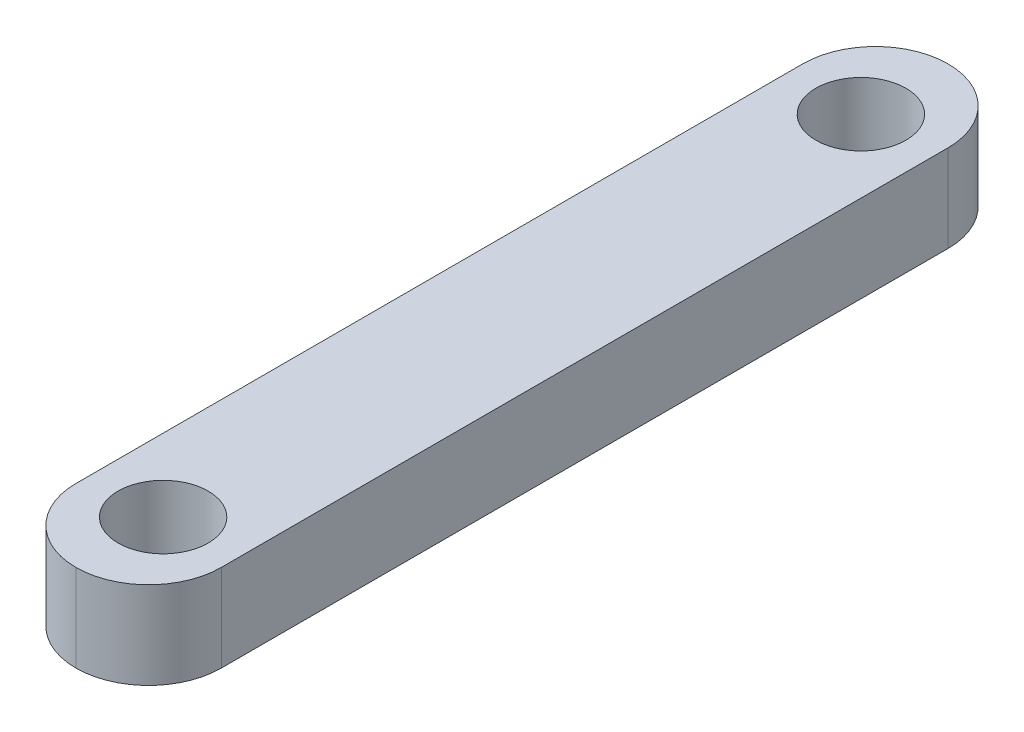
ISO-10303-21;
HEADER;
FILE_DESCRIPTION(('STEP AP214'),'2;1');
FILE_NAME('part.step','',(''),(''),'','','');
FILE_SCHEMA(('AUTOMOTIVE_DESIGN { 1 0 10303 214 1 1 1 1 }'));
ENDSEC;
DATA;
#1=APPLICATION_CONTEXT('core data for automotive mechanical design processes');
#2=APPLICATION_PROTOCOL_DEFINITION('international standard','automotive_design',2000,#1);
#3=PRODUCT_CONTEXT('',#1,'mechanical');
#4=PRODUCT('Part','Part','',(#3));
#5=PRODUCT_RELATED_PRODUCT_CATEGORY('part','',(#4));
#6=PRODUCT_DEFINITION_FORMATION('','',#4);
#7=PRODUCT_DEFINITION_CONTEXT('part definition',#1,'design');
#8=PRODUCT_DEFINITION('design','',#6,#7);
#9=PRODUCT_DEFINITION_SHAPE('','',#8);
#10=(LENGTH_UNIT() NAMED_UNIT(*) SI_UNIT(.MILLI.,.METRE.));
#11=(NAMED_UNIT(*) PLANE_ANGLE_UNIT() SI_UNIT($,.RADIAN.));
#12=(NAMED_UNIT(*) SI_UNIT($,.STERADIAN.) SOLID_ANGLE_UNIT());
#13=UNCERTAINTY_MEASURE_WITH_UNIT(LENGTH_MEASURE(1.E-05),#10,'distance_accuracy_value','');
#14=(GEOMETRIC_REPRESENTATION_CONTEXT(3) GLOBAL_UNCERTAINTY_ASSIGNED_CONTEXT((#13)) GLOBAL_UNIT_ASSIGNED_CONTEXT((#10,
#11,#12)) REPRESENTATION_CONTEXT('',''));
#15=CARTESIAN_POINT('',(0.,0.,0.));
#16=DIRECTION('',(0.,0.,1.));
#17=DIRECTION('',(1.,0.,0.));
#18=AXIS2_PLACEMENT_3D('',#15,#16,#17);
#19=CARTESIAN_POINT('',(0.,3.,0.));
#20=DIRECTION('',(0.,-1.,0.));
#21=DIRECTION('',(0.,0.,-1.));
#22=AXIS2_PLACEMENT_3D('',#19,#20,#21);
#23=PLANE('',#22);
#24=CARTESIAN_POINT('',(0.,3.,12.5));
#25=DIRECTION('',(0.,-1.,0.));
#26=DIRECTION('',(0.,0.,-1.));
#27=AXIS2_PLACEMENT_3D('',#24,#25,#26);
#28=CIRCLE('',#27,2.5);
#29=CARTESIAN_POINT('',(-2.5,3.,12.5));
#30=VERTEX_POINT('',#29);
#31=CARTESIAN_POINT('',(0.,3.,15.));
#32=VERTEX_POINT('',#31);
#33=EDGE_CURVE('E50',#30,#32,#28,.F.);
#34=ORIENTED_EDGE('',*,*,#33,.T.);
#35=CARTESIAN_POINT('',(0.,3.,12.5));
#36=DIRECTION('',(0.,-1.,0.));
#37=DIRECTION('',(0.,0.,-1.));
#38=AXIS2_PLACEMENT_3D('',#35,#36,#37);
#39=CIRCLE('',#38,2.5);
#40=CARTESIAN_POINT('',(2.5,3.,12.5));
#41=VERTEX_POINT('',#40);
#42=EDGE_CURVE('E134',#32,#41,#39,.F.);
#43=ORIENTED_EDGE('',*,*,#42,.T.);
#44=DIRECTION('',(0.,0.,-1.));
#45=VECTOR('',#44,1.);
#46=CARTESIAN_POINT('',(2.5,3.,15.));
#47=LINE('',#46,#45);
#48=CARTESIAN_POINT('',(2.5,3.,-12.5));
#49=VERTEX_POINT('',#48);
#50=EDGE_CURVE('E106',#41,#49,#47,.T.);
#51=ORIENTED_EDGE('',*,*,#50,.T.);
#52=CARTESIAN_POINT('',(0.,3.,-12.5));
#53=DIRECTION('',(0.,-1.,0.));
#54=DIRECTION('',(0.,0.,-1.));
#55=AXIS2_PLACEMENT_3D('',#52,#53,#54);
#56=CIRCLE('',#55,2.5);
#57=CARTESIAN_POINT('',(0.,3.,-15.));
#58=VERTEX_POINT('',#57);
#59=EDGE_CURVE('E131',#49,#58,#56,.F.);
#60=ORIENTED_EDGE('',*,*,#59,.T.);
#61=CARTESIAN_POINT('',(0.,3.,-12.5));
#62=DIRECTION('',(0.,-1.,0.));
#63=DIRECTION('',(0.,0.,-1.));
#64=AXIS2_PLACEMENT_3D('',#61,#62,#63);
#65=CIRCLE('',#64,2.5);
#66=CARTESIAN_POINT('',(-2.5,3.,-12.5));
#67=VERTEX_POINT('',#66);
#68=EDGE_CURVE('E129',#58,#67,#65,.F.);
#69=ORIENTED_EDGE('',*,*,#68,.T.);
#70=DIRECTION('',(0.,0.,1.));
#71=VECTOR('',#70,1.);
#72=CARTESIAN_POINT('',(-2.5,3.,15.));
#73=LINE('',#72,#71);
#74=EDGE_CURVE('E121',#67,#30,#73,.T.);
#75=ORIENTED_EDGE('',*,*,#74,.T.);
#76=EDGE_LOOP('',(#34,#43,#51,#60,#69,#75));
#77=FACE_BOUND('',#76,.T.);
#78=CARTESIAN_POINT('',(0.,3.,-12.));
#79=DIRECTION('',(0.,1.,0.));
#80=DIRECTION('',(0.,0.,1.));
#81=AXIS2_PLACEMENT_3D('',#78,#79,#80);
#82=CIRCLE('',#81,1.55);
#83=CARTESIAN_POINT('',(0.,3.,-10.45));
#84=VERTEX_POINT('',#83);
#85=EDGE_CURVE('E114',#84,#84,#82,.T.);
#86=ORIENTED_EDGE('',*,*,#85,.F.);
#87=EDGE_LOOP('',(#86));
#88=FACE_BOUND('',#87,.T.);
#89=CARTESIAN_POINT('',(0.,3.,12.));
#90=DIRECTION('',(0.,1.,0.));
#91=DIRECTION('',(0.,0.,1.));
#92=AXIS2_PLACEMENT_3D('',#89,#90,#91);
#93=CIRCLE('',#92,1.55);
#94=CARTESIAN_POINT('',(0.,3.,13.55));
#95=VERTEX_POINT('',#94);
#96=EDGE_CURVE('E142',#95,#95,#93,.T.);
#97=ORIENTED_EDGE('',*,*,#96,.F.);
#98=EDGE_LOOP('',(#97));
#99=FACE_BOUND('',#98,.T.);
#100=ADVANCED_FACE('F33',(#77,#88,#99),#23,.F.);
#101=CARTESIAN_POINT('',(0.,0.,0.));
#102=DIRECTION('',(0.,-1.,0.));
#103=DIRECTION('',(0.,0.,-1.));
#104=AXIS2_PLACEMENT_3D('',#101,#102,#103);
#105=PLANE('',#104);
#106=CARTESIAN_POINT('',(0.,0.,-12.));
#107=DIRECTION('',(0.,1.,0.));
#108=DIRECTION('',(0.,0.,1.));
#109=AXIS2_PLACEMENT_3D('',#106,#107,#108);
#110=CIRCLE('',#109,1.55);
#111=CARTESIAN_POINT('',(0.,0.,-10.45));
#112=VERTEX_POINT('',#111);
#113=EDGE_CURVE('E118',#112,#112,#110,.T.);
#114=ORIENTED_EDGE('',*,*,#113,.T.);
#115=EDGE_LOOP('',(#114));
#116=FACE_BOUND('',#115,.T.);
#117=DIRECTION('',(0.,0.,-1.));
#118=VECTOR('',#117,1.);
#119=CARTESIAN_POINT('',(2.5,0.,15.));
#120=LINE('',#119,#118);
#121=CARTESIAN_POINT('',(2.5,0.,12.5));
#122=VERTEX_POINT('',#121);
#123=CARTESIAN_POINT('',(2.5,0.,-12.5));
#124=VERTEX_POINT('',#123);
#125=EDGE_CURVE('E103',#122,#124,#120,.T.);
#126=ORIENTED_EDGE('',*,*,#125,.F.);
#127=CARTESIAN_POINT('',(0.,0.,12.5));
#128=DIRECTION('',(0.,-1.,0.));
#129=DIRECTION('',(0.,0.,-1.));
#130=AXIS2_PLACEMENT_3D('',#127,#128,#129);
#131=CIRCLE('',#130,2.5);
#132=CARTESIAN_POINT('',(0.,0.,15.));
#133=VERTEX_POINT('',#132);
#134=EDGE_CURVE('E88',#122,#133,#131,.T.);
#135=ORIENTED_EDGE('',*,*,#134,.T.);
#136=CARTESIAN_POINT('',(0.,0.,12.5));
#137=DIRECTION('',(0.,-1.,0.));
#138=DIRECTION('',(0.,0.,-1.));
#139=AXIS2_PLACEMENT_3D('',#136,#137,#138);
#140=CIRCLE('',#139,2.5);
#141=CARTESIAN_POINT('',(-2.5,0.,12.5));
#142=VERTEX_POINT('',#141);
#143=EDGE_CURVE('E96',#133,#142,#140,.T.);
#144=ORIENTED_EDGE('',*,*,#143,.T.);
#145=DIRECTION('',(0.,0.,1.));
#146=VECTOR('',#145,1.);
#147=CARTESIAN_POINT('',(-2.5,0.,15.));
#148=LINE('',#147,#146);
#149=CARTESIAN_POINT('',(-2.5,0.,-12.5));
#150=VERTEX_POINT('',#149);
#151=EDGE_CURVE('E113',#150,#142,#148,.T.);
#152=ORIENTED_EDGE('',*,*,#151,.F.);
#153=CARTESIAN_POINT('',(0.,0.,-12.5));
#154=DIRECTION('',(0.,-1.,0.));
#155=DIRECTION('',(0.,0.,-1.));
#156=AXIS2_PLACEMENT_3D('',#153,#154,#155);
#157=CIRCLE('',#156,2.5);
#158=CARTESIAN_POINT('',(0.,0.,-15.));
#159=VERTEX_POINT('',#158);
#160=EDGE_CURVE('E124',#150,#159,#157,.T.);
#161=ORIENTED_EDGE('',*,*,#160,.T.);
#162=CARTESIAN_POINT('',(0.,0.,-12.5));
#163=DIRECTION('',(0.,-1.,0.));
#164=DIRECTION('',(0.,0.,-1.));
#165=AXIS2_PLACEMENT_3D('',#162,#163,#164);
#166=CIRCLE('',#165,2.5);
#167=EDGE_CURVE('E112',#159,#124,#166,.T.);
#168=ORIENTED_EDGE('',*,*,#167,.T.);
#169=EDGE_LOOP('',(#126,#135,#144,#152,#161,#168));
#170=FACE_BOUND('',#169,.T.);
#171=CARTESIAN_POINT('',(0.,0.,12.));
#172=DIRECTION('',(0.,1.,0.));
#173=DIRECTION('',(0.,0.,1.));
#174=AXIS2_PLACEMENT_3D('',#171,#172,#173);
#175=CIRCLE('',#174,1.55);
#176=CARTESIAN_POINT('',(0.,0.,13.55));
#177=VERTEX_POINT('',#176);
#178=EDGE_CURVE('E138',#177,#177,#175,.T.);
#179=ORIENTED_EDGE('',*,*,#178,.T.);
#180=EDGE_LOOP('',(#179));
#181=FACE_BOUND('',#180,.T.);
#182=ADVANCED_FACE('F109',(#116,#170,#181),#105,.T.);
#183=CARTESIAN_POINT('',(2.5,3.,15.));
#184=DIRECTION('',(-1.,0.,0.));
#185=DIRECTION('',(0.,0.,1.));
#186=AXIS2_PLACEMENT_3D('',#183,#184,#185);
#187=PLANE('',#186);
#188=ORIENTED_EDGE('',*,*,#125,.T.);
#189=DIRECTION('',(0.,-1.,0.));
#190=VECTOR('',#189,1.);
#191=CARTESIAN_POINT('',(2.5,3.,-12.5));
#192=LINE('',#191,#190);
#193=EDGE_CURVE('E107',#124,#49,#192,.F.);
#194=ORIENTED_EDGE('',*,*,#193,.T.);
#195=ORIENTED_EDGE('',*,*,#50,.F.);
#196=DIRECTION('',(0.,-1.,0.));
#197=VECTOR('',#196,1.);
#198=CARTESIAN_POINT('',(2.5,3.,12.5));
#199=LINE('',#198,#197);
#200=EDGE_CURVE('E92',#41,#122,#199,.T.);
#201=ORIENTED_EDGE('',*,*,#200,.T.);
#202=EDGE_LOOP('',(#188,#194,#195,#201));
#203=FACE_BOUND('',#202,.T.);
#204=ADVANCED_FACE('F101',(#203),#187,.F.);
#205=CARTESIAN_POINT('',(-2.5,3.,15.));
#206=DIRECTION('',(1.,0.,0.));
#207=DIRECTION('',(0.,0.,-1.));
#208=AXIS2_PLACEMENT_3D('',#205,#206,#207);
#209=PLANE('',#208);
#210=ORIENTED_EDGE('',*,*,#151,.T.);
#211=DIRECTION('',(0.,-1.,0.));
#212=VECTOR('',#211,1.);
#213=CARTESIAN_POINT('',(-2.5,3.,12.5));
#214=LINE('',#213,#212);
#215=EDGE_CURVE('E11',#142,#30,#214,.F.);
#216=ORIENTED_EDGE('',*,*,#215,.T.);
#217=ORIENTED_EDGE('',*,*,#74,.F.);
#218=DIRECTION('',(0.,-1.,0.));
#219=VECTOR('',#218,1.);
#220=CARTESIAN_POINT('',(-2.5,3.,-12.5));
#221=LINE('',#220,#219);
#222=EDGE_CURVE('E42',#67,#150,#221,.T.);
#223=ORIENTED_EDGE('',*,*,#222,.T.);
#224=EDGE_LOOP('',(#210,#216,#217,#223));
#225=FACE_BOUND('',#224,.T.);
#226=ADVANCED_FACE('F155',(#225),#209,.F.);
#227=CARTESIAN_POINT('',(0.,3.,-12.));
#228=DIRECTION('',(0.,-1.,0.));
#229=DIRECTION('',(0.,0.,-1.));
#230=AXIS2_PLACEMENT_3D('',#227,#228,#229);
#231=CYLINDRICAL_SURFACE('',#230,1.55);
#232=ORIENTED_EDGE('',*,*,#85,.T.);
#233=EDGE_LOOP('',(#232));
#234=FACE_BOUND('',#233,.T.);
#235=ORIENTED_EDGE('',*,*,#113,.F.);
#236=EDGE_LOOP('',(#235));
#237=FACE_BOUND('',#236,.T.);
#238=ADVANCED_FACE('F177',(#234,#237),#231,.F.);
#239=CARTESIAN_POINT('',(0.,3.,12.));
#240=DIRECTION('',(0.,-1.,0.));
#241=DIRECTION('',(0.,0.,-1.));
#242=AXIS2_PLACEMENT_3D('',#239,#240,#241);
#243=CYLINDRICAL_SURFACE('',#242,1.55);
#244=ORIENTED_EDGE('',*,*,#96,.T.);
#245=EDGE_LOOP('',(#244));
#246=FACE_BOUND('',#245,.T.);
#247=ORIENTED_EDGE('',*,*,#178,.F.);
#248=EDGE_LOOP('',(#247));
#249=FACE_BOUND('',#248,.T.);
#250=ADVANCED_FACE('F165',(#246,#249),#243,.F.);
#251=CARTESIAN_POINT('',(0.,3.,-12.5));
#252=DIRECTION('',(0.,-1.,0.));
#253=DIRECTION('',(0.,0.,-1.));
#254=AXIS2_PLACEMENT_3D('',#251,#252,#253);
#255=CYLINDRICAL_SURFACE('',#254,2.5);
#256=ORIENTED_EDGE('',*,*,#222,.F.);
#257=ORIENTED_EDGE('',*,*,#68,.F.);
#258=DIRECTION('',(0.,-1.,0.));
#259=VECTOR('',#258,1.);
#260=CARTESIAN_POINT('',(0.,3.,-15.));
#261=LINE('',#260,#259);
#262=EDGE_CURVE('E136',#159,#58,#261,.F.);
#263=ORIENTED_EDGE('',*,*,#262,.F.);
#264=ORIENTED_EDGE('',*,*,#160,.F.);
#265=EDGE_LOOP('',(#256,#257,#263,#264));
#266=FACE_BOUND('',#265,.T.);
#267=ADVANCED_FACE('F157',(#266),#255,.T.);
#268=CARTESIAN_POINT('',(0.,3.,-12.5));
#269=DIRECTION('',(0.,-1.,0.));
#270=DIRECTION('',(0.,0.,-1.));
#271=AXIS2_PLACEMENT_3D('',#268,#269,#270);
#272=CYLINDRICAL_SURFACE('',#271,2.5);
#273=ORIENTED_EDGE('',*,*,#59,.F.);
#274=ORIENTED_EDGE('',*,*,#193,.F.);
#275=ORIENTED_EDGE('',*,*,#167,.F.);
#276=ORIENTED_EDGE('',*,*,#262,.T.);
#277=EDGE_LOOP('',(#273,#274,#275,#276));
#278=FACE_BOUND('',#277,.T.);
#279=ADVANCED_FACE('F158',(#278),#272,.T.);
#280=CARTESIAN_POINT('',(0.,3.,12.5));
#281=DIRECTION('',(0.,-1.,0.));
#282=DIRECTION('',(0.,0.,-1.));
#283=AXIS2_PLACEMENT_3D('',#280,#281,#282);
#284=CYLINDRICAL_SURFACE('',#283,2.5);
#285=DIRECTION('',(0.,-1.,0.));
#286=VECTOR('',#285,1.);
#287=CARTESIAN_POINT('',(0.,3.,15.));
#288=LINE('',#287,#286);
#289=EDGE_CURVE('E37',#32,#133,#288,.T.);
#290=ORIENTED_EDGE('',*,*,#289,.F.);
#291=ORIENTED_EDGE('',*,*,#33,.F.);
#292=ORIENTED_EDGE('',*,*,#215,.F.);
#293=ORIENTED_EDGE('',*,*,#143,.F.);
#294=EDGE_LOOP('',(#290,#291,#292,#293));
#295=FACE_BOUND('',#294,.T.);
#296=ADVANCED_FACE('F35',(#295),#284,.T.);
#297=CARTESIAN_POINT('',(0.,3.,12.5));
#298=DIRECTION('',(0.,-1.,0.));
#299=DIRECTION('',(0.,0.,-1.));
#300=AXIS2_PLACEMENT_3D('',#297,#298,#299);
#301=CYLINDRICAL_SURFACE('',#300,2.5);
#302=ORIENTED_EDGE('',*,*,#42,.F.);
#303=ORIENTED_EDGE('',*,*,#289,.T.);
#304=ORIENTED_EDGE('',*,*,#134,.F.);
#305=ORIENTED_EDGE('',*,*,#200,.F.);
#306=EDGE_LOOP('',(#302,#303,#304,#305));
#307=FACE_BOUND('',#306,.T.);
#308=ADVANCED_FACE('F91',(#307),#301,.T.);
#309=CLOSED_SHELL('',(#100,#182,#204,#226,#238,#250,#267,#279,#296,#308));
#310=MANIFOLD_SOLID_BREP('B2',#309);
#311=ADVANCED_BREP_SHAPE_REPRESENTATION('',(#18,#310),#14);
#312=SHAPE_DEFINITION_REPRESENTATION(#9,#311);
ENDSEC;
END-ISO-10303-21;
